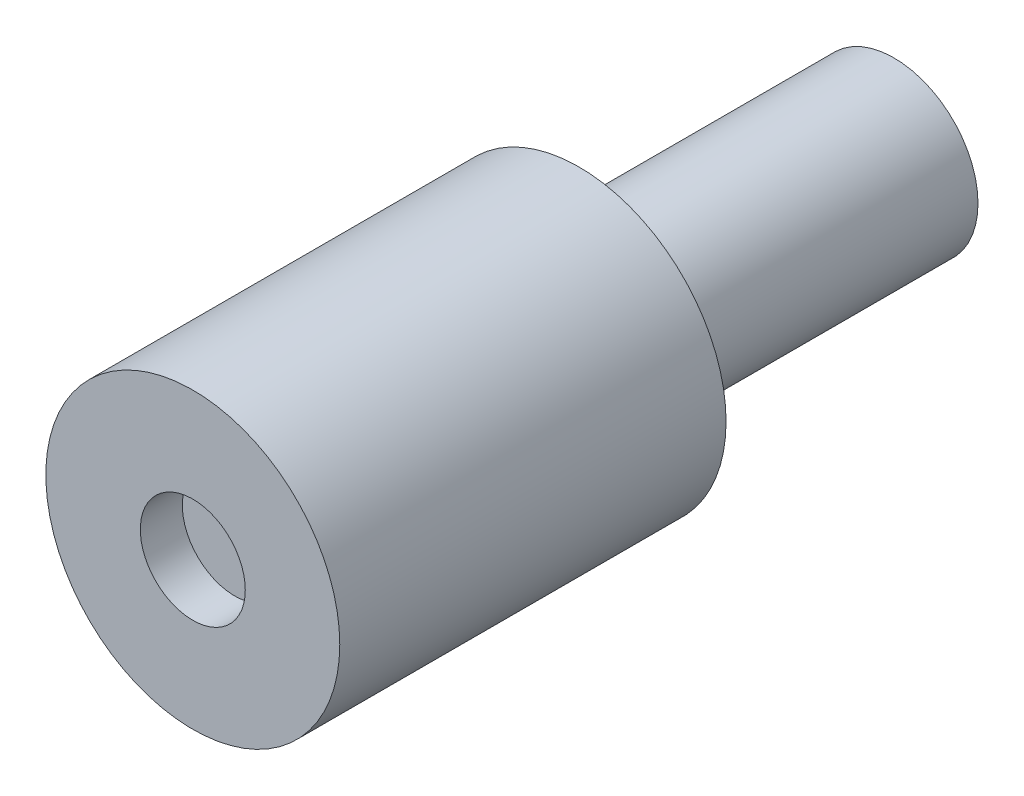
ISO-10303-21;
HEADER;
FILE_DESCRIPTION(('STEP AP214'),'2;1');
FILE_NAME('part.step','',(''),(''),'','','');
FILE_SCHEMA(('AUTOMOTIVE_DESIGN { 1 0 10303 214 1 1 1 1 }'));
ENDSEC;
DATA;
#1=APPLICATION_CONTEXT('core data for automotive mechanical design processes');
#2=APPLICATION_PROTOCOL_DEFINITION('international standard','automotive_design',2000,#1);
#3=PRODUCT_CONTEXT('',#1,'mechanical');
#4=PRODUCT('Part','Part','',(#3));
#5=PRODUCT_RELATED_PRODUCT_CATEGORY('part','',(#4));
#6=PRODUCT_DEFINITION_FORMATION('','',#4);
#7=PRODUCT_DEFINITION_CONTEXT('part definition',#1,'design');
#8=PRODUCT_DEFINITION('design','',#6,#7);
#9=PRODUCT_DEFINITION_SHAPE('','',#8);
#10=(LENGTH_UNIT() NAMED_UNIT(*) SI_UNIT(.MILLI.,.METRE.));
#11=(NAMED_UNIT(*) PLANE_ANGLE_UNIT() SI_UNIT($,.RADIAN.));
#12=(NAMED_UNIT(*) SI_UNIT($,.STERADIAN.) SOLID_ANGLE_UNIT());
#13=UNCERTAINTY_MEASURE_WITH_UNIT(LENGTH_MEASURE(1.E-05),#10,'distance_accuracy_value','');
#14=(GEOMETRIC_REPRESENTATION_CONTEXT(3) GLOBAL_UNCERTAINTY_ASSIGNED_CONTEXT((#13)) GLOBAL_UNIT_ASSIGNED_CONTEXT((#10,
#11,#12)) REPRESENTATION_CONTEXT('',''));
#15=CARTESIAN_POINT('',(0.,0.,0.));
#16=DIRECTION('',(0.,0.,1.));
#17=DIRECTION('',(1.,0.,0.));
#18=AXIS2_PLACEMENT_3D('',#15,#16,#17);
#19=CARTESIAN_POINT('',(0.,0.,15.));
#20=DIRECTION('',(0.,0.,-1.));
#21=DIRECTION('',(-1.,0.,0.));
#22=AXIS2_PLACEMENT_3D('',#19,#20,#21);
#23=CYLINDRICAL_SURFACE('',#22,4.);
#24=CARTESIAN_POINT('',(0.,0.,15.));
#25=DIRECTION('',(0.,0.,1.));
#26=DIRECTION('',(1.,0.,0.));
#27=AXIS2_PLACEMENT_3D('',#24,#25,#26);
#28=CIRCLE('',#27,4.);
#29=CARTESIAN_POINT('',(4.,0.,15.));
#30=VERTEX_POINT('',#29);
#31=EDGE_CURVE('E10',#30,#30,#28,.T.);
#32=ORIENTED_EDGE('',*,*,#31,.F.);
#33=EDGE_LOOP('',(#32));
#34=FACE_BOUND('',#33,.T.);
#35=CARTESIAN_POINT('',(0.,0.,0.));
#36=DIRECTION('',(0.,0.,1.));
#37=DIRECTION('',(1.,0.,0.));
#38=AXIS2_PLACEMENT_3D('',#35,#36,#37);
#39=CIRCLE('',#38,4.);
#40=CARTESIAN_POINT('',(4.,0.,0.));
#41=VERTEX_POINT('',#40);
#42=EDGE_CURVE('E40',#41,#41,#39,.T.);
#43=ORIENTED_EDGE('',*,*,#42,.T.);
#44=EDGE_LOOP('',(#43));
#45=FACE_BOUND('',#44,.T.);
#46=ADVANCED_FACE('F37',(#34,#45),#23,.T.);
#47=CARTESIAN_POINT('',(0.,0.,0.));
#48=DIRECTION('',(0.,0.,1.));
#49=DIRECTION('',(1.,0.,0.));
#50=AXIS2_PLACEMENT_3D('',#47,#48,#49);
#51=PLANE('',#50);
#52=ORIENTED_EDGE('',*,*,#42,.F.);
#53=EDGE_LOOP('',(#52));
#54=FACE_BOUND('',#53,.T.);
#55=ADVANCED_FACE('F85',(#54),#51,.F.);
#56=CARTESIAN_POINT('',(0.,0.,33.4));
#57=DIRECTION('',(0.,0.,-1.));
#58=DIRECTION('',(-1.,0.,0.));
#59=AXIS2_PLACEMENT_3D('',#56,#57,#58);
#60=CYLINDRICAL_SURFACE('',#59,7.);
#61=CARTESIAN_POINT('',(0.,0.,33.4));
#62=DIRECTION('',(0.,0.,1.));
#63=DIRECTION('',(1.,0.,0.));
#64=AXIS2_PLACEMENT_3D('',#61,#62,#63);
#65=CIRCLE('',#64,7.);
#66=CARTESIAN_POINT('',(7.,0.,33.4));
#67=VERTEX_POINT('',#66);
#68=EDGE_CURVE('E49',#67,#67,#65,.T.);
#69=ORIENTED_EDGE('',*,*,#68,.F.);
#70=EDGE_LOOP('',(#69));
#71=FACE_BOUND('',#70,.T.);
#72=CARTESIAN_POINT('',(0.,0.,15.));
#73=DIRECTION('',(0.,0.,1.));
#74=DIRECTION('',(1.,0.,0.));
#75=AXIS2_PLACEMENT_3D('',#72,#73,#74);
#76=CIRCLE('',#75,7.);
#77=CARTESIAN_POINT('',(7.,0.,15.));
#78=VERTEX_POINT('',#77);
#79=EDGE_CURVE('E51',#78,#78,#76,.T.);
#80=ORIENTED_EDGE('',*,*,#79,.T.);
#81=EDGE_LOOP('',(#80));
#82=FACE_BOUND('',#81,.T.);
#83=ADVANCED_FACE('F79',(#71,#82),#60,.T.);
#84=CARTESIAN_POINT('',(0.,0.,33.4));
#85=DIRECTION('',(0.,0.,1.));
#86=DIRECTION('',(1.,0.,0.));
#87=AXIS2_PLACEMENT_3D('',#84,#85,#86);
#88=PLANE('',#87);
#89=CARTESIAN_POINT('',(0.,0.,33.4));
#90=DIRECTION('',(0.,0.,1.));
#91=DIRECTION('',(1.,0.,0.));
#92=AXIS2_PLACEMENT_3D('',#89,#90,#91);
#93=CIRCLE('',#92,2.5);
#94=CARTESIAN_POINT('',(2.5,0.,33.4));
#95=VERTEX_POINT('',#94);
#96=EDGE_CURVE('E59',#95,#95,#93,.T.);
#97=ORIENTED_EDGE('',*,*,#96,.F.);
#98=EDGE_LOOP('',(#97));
#99=FACE_BOUND('',#98,.T.);
#100=ORIENTED_EDGE('',*,*,#68,.T.);
#101=EDGE_LOOP('',(#100));
#102=FACE_BOUND('',#101,.T.);
#103=ADVANCED_FACE('F76',(#99,#102),#88,.T.);
#104=CARTESIAN_POINT('',(0.,0.,15.));
#105=DIRECTION('',(0.,0.,1.));
#106=DIRECTION('',(1.,0.,0.));
#107=AXIS2_PLACEMENT_3D('',#104,#105,#106);
#108=PLANE('',#107);
#109=ORIENTED_EDGE('',*,*,#31,.T.);
#110=EDGE_LOOP('',(#109));
#111=FACE_BOUND('',#110,.T.);
#112=ORIENTED_EDGE('',*,*,#79,.F.);
#113=EDGE_LOOP('',(#112));
#114=FACE_BOUND('',#113,.T.);
#115=ADVANCED_FACE('F72',(#111,#114),#108,.F.);
#116=CARTESIAN_POINT('',(0.,0.,31.4));
#117=DIRECTION('',(0.,0.,1.));
#118=DIRECTION('',(1.,0.,0.));
#119=AXIS2_PLACEMENT_3D('',#116,#117,#118);
#120=CYLINDRICAL_SURFACE('',#119,2.5);
#121=CARTESIAN_POINT('',(0.,0.,31.4));
#122=DIRECTION('',(0.,0.,1.));
#123=DIRECTION('',(1.,0.,0.));
#124=AXIS2_PLACEMENT_3D('',#121,#122,#123);
#125=CIRCLE('',#124,2.5);
#126=CARTESIAN_POINT('',(2.5,0.,31.4));
#127=VERTEX_POINT('',#126);
#128=EDGE_CURVE('E55',#127,#127,#125,.T.);
#129=ORIENTED_EDGE('',*,*,#128,.F.);
#130=EDGE_LOOP('',(#129));
#131=FACE_BOUND('',#130,.T.);
#132=ORIENTED_EDGE('',*,*,#96,.T.);
#133=EDGE_LOOP('',(#132));
#134=FACE_BOUND('',#133,.T.);
#135=ADVANCED_FACE('F69',(#131,#134),#120,.F.);
#136=CARTESIAN_POINT('',(0.,0.,31.4));
#137=DIRECTION('',(0.,0.,1.));
#138=DIRECTION('',(1.,0.,0.));
#139=AXIS2_PLACEMENT_3D('',#136,#137,#138);
#140=PLANE('',#139);
#141=ORIENTED_EDGE('',*,*,#128,.T.);
#142=EDGE_LOOP('',(#141));
#143=FACE_BOUND('',#142,.T.);
#144=ADVANCED_FACE('F67',(#143),#140,.T.);
#145=CLOSED_SHELL('',(#46,#55,#83,#103,#115,#135,#144));
#146=MANIFOLD_SOLID_BREP('B2',#145);
#147=ADVANCED_BREP_SHAPE_REPRESENTATION('',(#18,#146),#14);
#148=SHAPE_DEFINITION_REPRESENTATION(#9,#147);
ENDSEC;
END-ISO-10303-21;
